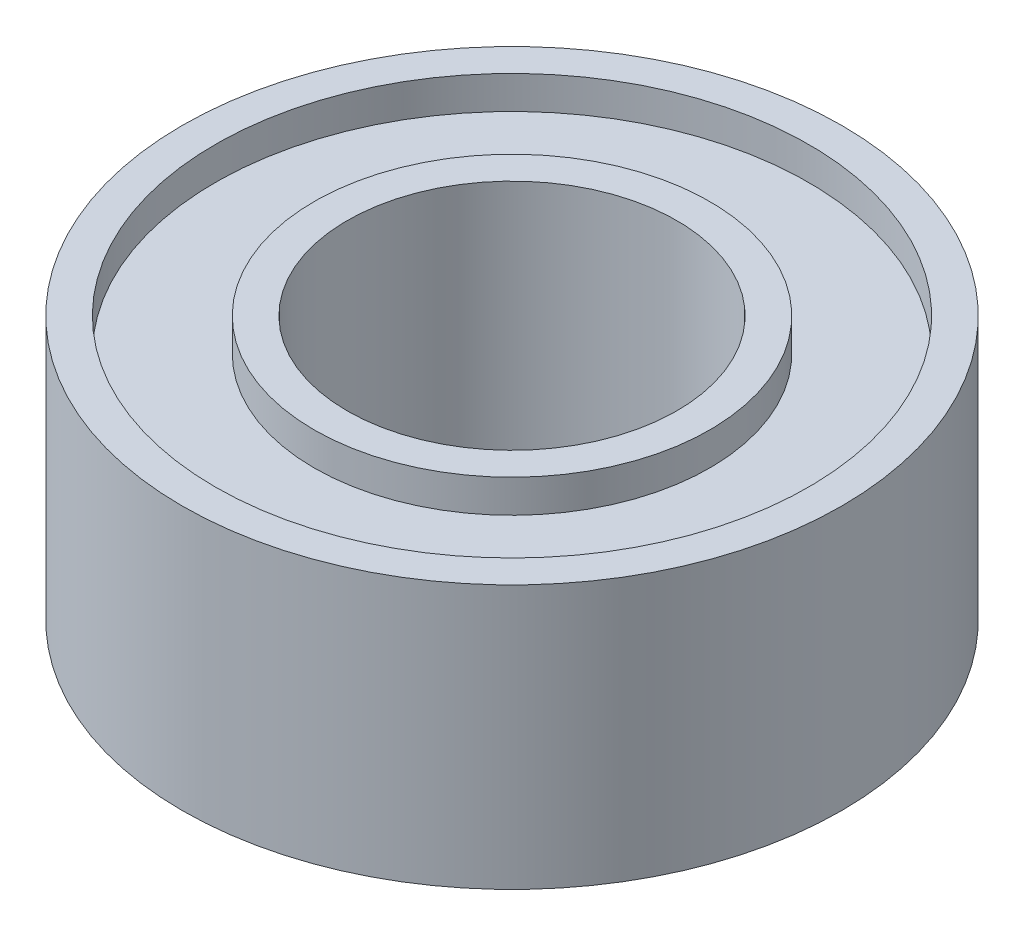
ISO-10303-21;
HEADER;
FILE_DESCRIPTION(('STEP AP214'),'2;1');
FILE_NAME('part.step','',(''),(''),'','','');
FILE_SCHEMA(('AUTOMOTIVE_DESIGN { 1 0 10303 214 1 1 1 1 }'));
ENDSEC;
DATA;
#1=APPLICATION_CONTEXT('core data for automotive mechanical design processes');
#2=APPLICATION_PROTOCOL_DEFINITION('international standard','automotive_design',2000,#1);
#3=PRODUCT_CONTEXT('',#1,'mechanical');
#4=PRODUCT('Part','Part','',(#3));
#5=PRODUCT_RELATED_PRODUCT_CATEGORY('part','',(#4));
#6=PRODUCT_DEFINITION_FORMATION('','',#4);
#7=PRODUCT_DEFINITION_CONTEXT('part definition',#1,'design');
#8=PRODUCT_DEFINITION('design','',#6,#7);
#9=PRODUCT_DEFINITION_SHAPE('','',#8);
#10=(LENGTH_UNIT() NAMED_UNIT(*) SI_UNIT(.MILLI.,.METRE.));
#11=(NAMED_UNIT(*) PLANE_ANGLE_UNIT() SI_UNIT($,.RADIAN.));
#12=(NAMED_UNIT(*) SI_UNIT($,.STERADIAN.) SOLID_ANGLE_UNIT());
#13=UNCERTAINTY_MEASURE_WITH_UNIT(LENGTH_MEASURE(1.E-05),#10,'distance_accuracy_value','');
#14=(GEOMETRIC_REPRESENTATION_CONTEXT(3) GLOBAL_UNCERTAINTY_ASSIGNED_CONTEXT((#13)) GLOBAL_UNIT_ASSIGNED_CONTEXT((#10,
#11,#12)) REPRESENTATION_CONTEXT('',''));
#15=CARTESIAN_POINT('',(0.,0.,0.));
#16=DIRECTION('',(0.,0.,1.));
#17=DIRECTION('',(1.,0.,0.));
#18=AXIS2_PLACEMENT_3D('',#15,#16,#17);
#19=CARTESIAN_POINT('',(0.,0.,0.));
#20=DIRECTION('',(0.,1.,0.));
#21=DIRECTION('',(0.,0.,1.));
#22=AXIS2_PLACEMENT_3D('',#19,#20,#21);
#23=PLANE('',#22);
#24=CARTESIAN_POINT('',(0.,0.,0.));
#25=DIRECTION('',(0.,1.,0.));
#26=DIRECTION('',(0.,0.,1.));
#27=AXIS2_PLACEMENT_3D('',#24,#25,#26);
#28=CIRCLE('',#27,2.5);
#29=CARTESIAN_POINT('',(0.,0.,2.5));
#30=VERTEX_POINT('',#29);
#31=EDGE_CURVE('E46',#30,#30,#28,.T.);
#32=ORIENTED_EDGE('',*,*,#31,.T.);
#33=EDGE_LOOP('',(#32));
#34=FACE_BOUND('',#33,.T.);
#35=CARTESIAN_POINT('',(0.,0.,0.));
#36=DIRECTION('',(0.,-1.,0.));
#37=DIRECTION('',(0.,0.,-1.));
#38=AXIS2_PLACEMENT_3D('',#35,#36,#37);
#39=CIRCLE('',#38,3.);
#40=CARTESIAN_POINT('',(0.,0.,-3.));
#41=VERTEX_POINT('',#40);
#42=EDGE_CURVE('E70',#41,#41,#39,.T.);
#43=ORIENTED_EDGE('',*,*,#42,.T.);
#44=EDGE_LOOP('',(#43));
#45=FACE_BOUND('',#44,.T.);
#46=ADVANCED_FACE('F33',(#34,#45),#23,.F.);
#47=CARTESIAN_POINT('',(0.,4.,0.));
#48=DIRECTION('',(0.,1.,0.));
#49=DIRECTION('',(0.,0.,1.));
#50=AXIS2_PLACEMENT_3D('',#47,#48,#49);
#51=PLANE('',#50);
#52=CARTESIAN_POINT('',(0.,4.,0.));
#53=DIRECTION('',(0.,1.,0.));
#54=DIRECTION('',(0.,0.,1.));
#55=AXIS2_PLACEMENT_3D('',#52,#53,#54);
#56=CIRCLE('',#55,2.5);
#57=CARTESIAN_POINT('',(0.,4.,2.5));
#58=VERTEX_POINT('',#57);
#59=EDGE_CURVE('E44',#58,#58,#56,.T.);
#60=ORIENTED_EDGE('',*,*,#59,.F.);
#61=EDGE_LOOP('',(#60));
#62=FACE_BOUND('',#61,.T.);
#63=CARTESIAN_POINT('',(0.,4.,0.));
#64=DIRECTION('',(0.,1.,0.));
#65=DIRECTION('',(0.,0.,1.));
#66=AXIS2_PLACEMENT_3D('',#63,#64,#65);
#67=CIRCLE('',#66,3.);
#68=CARTESIAN_POINT('',(0.,4.,3.));
#69=VERTEX_POINT('',#68);
#70=EDGE_CURVE('E58',#69,#69,#67,.T.);
#71=ORIENTED_EDGE('',*,*,#70,.T.);
#72=EDGE_LOOP('',(#71));
#73=FACE_BOUND('',#72,.T.);
#74=ADVANCED_FACE('F108',(#62,#73),#51,.T.);
#75=CARTESIAN_POINT('',(0.,4.,0.));
#76=DIRECTION('',(0.,1.,0.));
#77=DIRECTION('',(0.,0.,1.));
#78=AXIS2_PLACEMENT_3D('',#75,#76,#77);
#79=CIRCLE('',#78,4.5);
#80=CARTESIAN_POINT('',(0.,4.,4.5));
#81=VERTEX_POINT('',#80);
#82=EDGE_CURVE('E52',#81,#81,#79,.T.);
#83=ORIENTED_EDGE('',*,*,#82,.F.);
#84=EDGE_LOOP('',(#83));
#85=FACE_BOUND('',#84,.T.);
#86=CARTESIAN_POINT('',(0.,4.,0.));
#87=DIRECTION('',(0.,1.,0.));
#88=DIRECTION('',(0.,0.,1.));
#89=AXIS2_PLACEMENT_3D('',#86,#87,#88);
#90=CIRCLE('',#89,5.);
#91=CARTESIAN_POINT('',(0.,4.,5.));
#92=VERTEX_POINT('',#91);
#93=EDGE_CURVE('E10',#92,#92,#90,.T.);
#94=ORIENTED_EDGE('',*,*,#93,.T.);
#95=EDGE_LOOP('',(#94));
#96=FACE_BOUND('',#95,.T.);
#97=ADVANCED_FACE('F95',(#85,#96),#51,.T.);
#98=CARTESIAN_POINT('',(0.,0.,0.));
#99=DIRECTION('',(0.,-1.,0.));
#100=DIRECTION('',(0.,0.,-1.));
#101=AXIS2_PLACEMENT_3D('',#98,#99,#100);
#102=CIRCLE('',#101,4.5);
#103=CARTESIAN_POINT('',(0.,0.,-4.5));
#104=VERTEX_POINT('',#103);
#105=EDGE_CURVE('E64',#104,#104,#102,.T.);
#106=ORIENTED_EDGE('',*,*,#105,.F.);
#107=EDGE_LOOP('',(#106));
#108=FACE_BOUND('',#107,.T.);
#109=CARTESIAN_POINT('',(0.,0.,0.));
#110=DIRECTION('',(0.,1.,0.));
#111=DIRECTION('',(0.,0.,1.));
#112=AXIS2_PLACEMENT_3D('',#109,#110,#111);
#113=CIRCLE('',#112,5.);
#114=CARTESIAN_POINT('',(0.,0.,5.));
#115=VERTEX_POINT('',#114);
#116=EDGE_CURVE('E37',#115,#115,#113,.T.);
#117=ORIENTED_EDGE('',*,*,#116,.F.);
#118=EDGE_LOOP('',(#117));
#119=FACE_BOUND('',#118,.T.);
#120=ADVANCED_FACE('F92',(#108,#119),#23,.F.);
#121=CARTESIAN_POINT('',(0.,4.,0.));
#122=DIRECTION('',(0.,-1.,0.));
#123=DIRECTION('',(0.,0.,-1.));
#124=AXIS2_PLACEMENT_3D('',#121,#122,#123);
#125=CYLINDRICAL_SURFACE('',#124,5.);
#126=ORIENTED_EDGE('',*,*,#93,.F.);
#127=EDGE_LOOP('',(#126));
#128=FACE_BOUND('',#127,.T.);
#129=ORIENTED_EDGE('',*,*,#116,.T.);
#130=EDGE_LOOP('',(#129));
#131=FACE_BOUND('',#130,.T.);
#132=ADVANCED_FACE('F35',(#128,#131),#125,.T.);
#133=CARTESIAN_POINT('',(0.,4.,0.));
#134=DIRECTION('',(0.,-1.,0.));
#135=DIRECTION('',(0.,0.,-1.));
#136=AXIS2_PLACEMENT_3D('',#133,#134,#135);
#137=CYLINDRICAL_SURFACE('',#136,2.5);
#138=ORIENTED_EDGE('',*,*,#59,.T.);
#139=EDGE_LOOP('',(#138));
#140=FACE_BOUND('',#139,.T.);
#141=ORIENTED_EDGE('',*,*,#31,.F.);
#142=EDGE_LOOP('',(#141));
#143=FACE_BOUND('',#142,.T.);
#144=ADVANCED_FACE('F99',(#140,#143),#137,.F.);
#145=CARTESIAN_POINT('',(0.,3.5,0.));
#146=DIRECTION('',(0.,1.,0.));
#147=DIRECTION('',(0.,0.,1.));
#148=AXIS2_PLACEMENT_3D('',#145,#146,#147);
#149=CYLINDRICAL_SURFACE('',#148,4.5);
#150=CARTESIAN_POINT('',(0.,3.5,0.));
#151=DIRECTION('',(0.,1.,0.));
#152=DIRECTION('',(0.,0.,1.));
#153=AXIS2_PLACEMENT_3D('',#150,#151,#152);
#154=CIRCLE('',#153,4.5);
#155=CARTESIAN_POINT('',(0.,3.5,4.5));
#156=VERTEX_POINT('',#155);
#157=EDGE_CURVE('E49',#156,#156,#154,.T.);
#158=ORIENTED_EDGE('',*,*,#157,.F.);
#159=EDGE_LOOP('',(#158));
#160=FACE_BOUND('',#159,.T.);
#161=ORIENTED_EDGE('',*,*,#82,.T.);
#162=EDGE_LOOP('',(#161));
#163=FACE_BOUND('',#162,.T.);
#164=ADVANCED_FACE('F104',(#160,#163),#149,.F.);
#165=CARTESIAN_POINT('',(0.,3.5,0.));
#166=DIRECTION('',(0.,1.,0.));
#167=DIRECTION('',(0.,0.,1.));
#168=AXIS2_PLACEMENT_3D('',#165,#166,#167);
#169=PLANE('',#168);
#170=CARTESIAN_POINT('',(0.,3.5,0.));
#171=DIRECTION('',(0.,1.,0.));
#172=DIRECTION('',(0.,0.,1.));
#173=AXIS2_PLACEMENT_3D('',#170,#171,#172);
#174=CIRCLE('',#173,3.);
#175=CARTESIAN_POINT('',(0.,3.5,3.));
#176=VERTEX_POINT('',#175);
#177=EDGE_CURVE('E55',#176,#176,#174,.T.);
#178=ORIENTED_EDGE('',*,*,#177,.F.);
#179=EDGE_LOOP('',(#178));
#180=FACE_BOUND('',#179,.T.);
#181=ORIENTED_EDGE('',*,*,#157,.T.);
#182=EDGE_LOOP('',(#181));
#183=FACE_BOUND('',#182,.T.);
#184=ADVANCED_FACE('F121',(#180,#183),#169,.T.);
#185=CARTESIAN_POINT('',(0.,3.5,0.));
#186=DIRECTION('',(0.,1.,0.));
#187=DIRECTION('',(0.,0.,1.));
#188=AXIS2_PLACEMENT_3D('',#185,#186,#187);
#189=CYLINDRICAL_SURFACE('',#188,3.);
#190=ORIENTED_EDGE('',*,*,#177,.T.);
#191=EDGE_LOOP('',(#190));
#192=FACE_BOUND('',#191,.T.);
#193=ORIENTED_EDGE('',*,*,#70,.F.);
#194=EDGE_LOOP('',(#193));
#195=FACE_BOUND('',#194,.T.);
#196=ADVANCED_FACE('F88',(#192,#195),#189,.T.);
#197=CARTESIAN_POINT('',(0.,0.5,0.));
#198=DIRECTION('',(0.,-1.,0.));
#199=DIRECTION('',(0.,0.,-1.));
#200=AXIS2_PLACEMENT_3D('',#197,#198,#199);
#201=CYLINDRICAL_SURFACE('',#200,4.5);
#202=CARTESIAN_POINT('',(0.,0.5,0.));
#203=DIRECTION('',(0.,-1.,0.));
#204=DIRECTION('',(0.,0.,-1.));
#205=AXIS2_PLACEMENT_3D('',#202,#203,#204);
#206=CIRCLE('',#205,4.5);
#207=CARTESIAN_POINT('',(0.,0.5,-4.5));
#208=VERTEX_POINT('',#207);
#209=EDGE_CURVE('E61',#208,#208,#206,.T.);
#210=ORIENTED_EDGE('',*,*,#209,.F.);
#211=EDGE_LOOP('',(#210));
#212=FACE_BOUND('',#211,.T.);
#213=ORIENTED_EDGE('',*,*,#105,.T.);
#214=EDGE_LOOP('',(#213));
#215=FACE_BOUND('',#214,.T.);
#216=ADVANCED_FACE('F82',(#212,#215),#201,.F.);
#217=CARTESIAN_POINT('',(0.,0.5,0.));
#218=DIRECTION('',(0.,-1.,0.));
#219=DIRECTION('',(0.,0.,-1.));
#220=AXIS2_PLACEMENT_3D('',#217,#218,#219);
#221=PLANE('',#220);
#222=CARTESIAN_POINT('',(0.,0.5,0.));
#223=DIRECTION('',(0.,-1.,0.));
#224=DIRECTION('',(0.,0.,-1.));
#225=AXIS2_PLACEMENT_3D('',#222,#223,#224);
#226=CIRCLE('',#225,3.);
#227=CARTESIAN_POINT('',(0.,0.5,-3.));
#228=VERTEX_POINT('',#227);
#229=EDGE_CURVE('E67',#228,#228,#226,.T.);
#230=ORIENTED_EDGE('',*,*,#229,.F.);
#231=EDGE_LOOP('',(#230));
#232=FACE_BOUND('',#231,.T.);
#233=ORIENTED_EDGE('',*,*,#209,.T.);
#234=EDGE_LOOP('',(#233));
#235=FACE_BOUND('',#234,.T.);
#236=ADVANCED_FACE('F79',(#232,#235),#221,.T.);
#237=CARTESIAN_POINT('',(0.,0.5,0.));
#238=DIRECTION('',(0.,-1.,0.));
#239=DIRECTION('',(0.,0.,-1.));
#240=AXIS2_PLACEMENT_3D('',#237,#238,#239);
#241=CYLINDRICAL_SURFACE('',#240,3.);
#242=ORIENTED_EDGE('',*,*,#229,.T.);
#243=EDGE_LOOP('',(#242));
#244=FACE_BOUND('',#243,.T.);
#245=ORIENTED_EDGE('',*,*,#42,.F.);
#246=EDGE_LOOP('',(#245));
#247=FACE_BOUND('',#246,.T.);
#248=ADVANCED_FACE('F76',(#244,#247),#241,.T.);
#249=CLOSED_SHELL('',(#46,#74,#97,#120,#132,#144,#164,#184,#196,#216,#236,#248));
#250=MANIFOLD_SOLID_BREP('B2',#249);
#251=ADVANCED_BREP_SHAPE_REPRESENTATION('',(#18,#250),#14);
#252=SHAPE_DEFINITION_REPRESENTATION(#9,#251);
ENDSEC;
END-ISO-10303-21;
